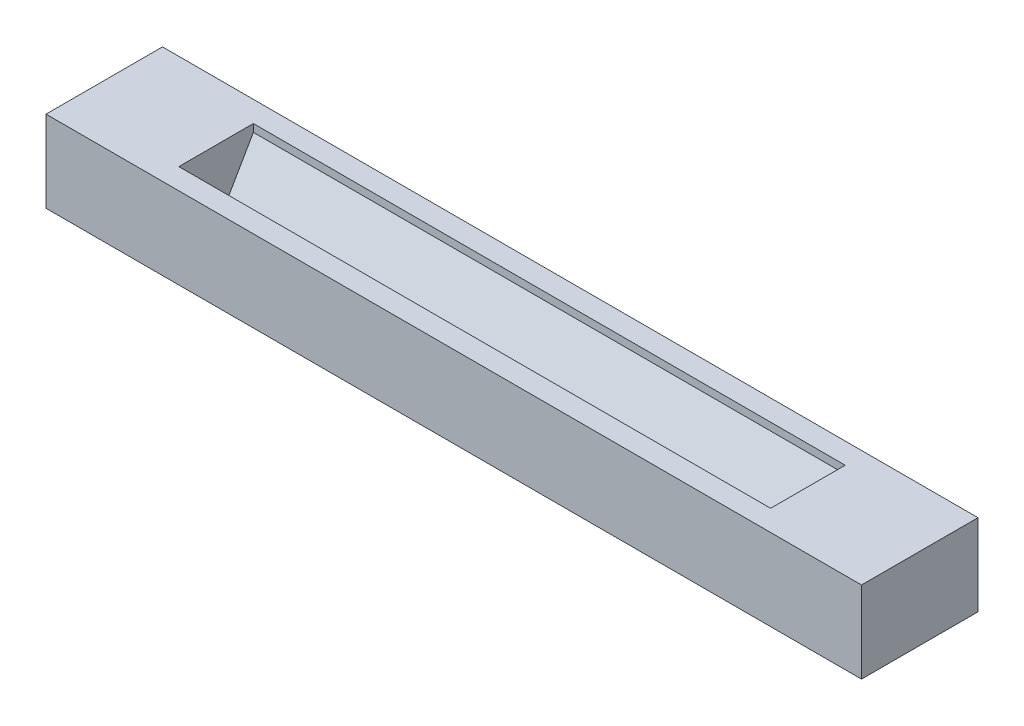
ISO-10303-21;
HEADER;
FILE_DESCRIPTION(('STEP AP214'),'2;1');
FILE_NAME('part.step','',(''),(''),'','','');
FILE_SCHEMA(('AUTOMOTIVE_DESIGN { 1 0 10303 214 1 1 1 1 }'));
ENDSEC;
DATA;
#1=APPLICATION_CONTEXT('core data for automotive mechanical design processes');
#2=APPLICATION_PROTOCOL_DEFINITION('international standard','automotive_design',2000,#1);
#3=PRODUCT_CONTEXT('',#1,'mechanical');
#4=PRODUCT('Part','Part','',(#3));
#5=PRODUCT_RELATED_PRODUCT_CATEGORY('part','',(#4));
#6=PRODUCT_DEFINITION_FORMATION('','',#4);
#7=PRODUCT_DEFINITION_CONTEXT('part definition',#1,'design');
#8=PRODUCT_DEFINITION('design','',#6,#7);
#9=PRODUCT_DEFINITION_SHAPE('','',#8);
#10=(LENGTH_UNIT() NAMED_UNIT(*) SI_UNIT(.MILLI.,.METRE.));
#11=(NAMED_UNIT(*) PLANE_ANGLE_UNIT() SI_UNIT($,.RADIAN.));
#12=(NAMED_UNIT(*) SI_UNIT($,.STERADIAN.) SOLID_ANGLE_UNIT());
#13=UNCERTAINTY_MEASURE_WITH_UNIT(LENGTH_MEASURE(1.E-05),#10,'distance_accuracy_value','');
#14=(GEOMETRIC_REPRESENTATION_CONTEXT(3) GLOBAL_UNCERTAINTY_ASSIGNED_CONTEXT((#13)) GLOBAL_UNIT_ASSIGNED_CONTEXT((#10,
#11,#12)) REPRESENTATION_CONTEXT('',''));
#15=CARTESIAN_POINT('',(0.,0.,0.));
#16=DIRECTION('',(0.,0.,1.));
#17=DIRECTION('',(1.,0.,0.));
#18=AXIS2_PLACEMENT_3D('',#15,#16,#17);
#19=CARTESIAN_POINT('',(-35.,3.5,-1.99999999999998));
#20=DIRECTION('',(0.,0.,1.));
#21=DIRECTION('',(1.,0.,0.));
#22=AXIS2_PLACEMENT_3D('',#19,#20,#21);
#23=PLANE('',#22);
#24=DIRECTION('',(-1.,0.,0.));
#25=VECTOR('',#24,1.);
#26=CARTESIAN_POINT('',(-35.,0.,-1.99999999999998));
#27=LINE('',#26,#25);
#28=CARTESIAN_POINT('',(0.,0.,-2.));
#29=VERTEX_POINT('',#28);
#30=CARTESIAN_POINT('',(-35.,0.,-1.99999999999998));
#31=VERTEX_POINT('',#30);
#32=EDGE_CURVE('E139',#29,#31,#27,.T.);
#33=ORIENTED_EDGE('',*,*,#32,.T.);
#34=DIRECTION('',(0.,-1.,0.));
#35=VECTOR('',#34,1.);
#36=CARTESIAN_POINT('',(-35.,3.5,-1.99999999999998));
#37=LINE('',#36,#35);
#38=CARTESIAN_POINT('',(-35.,3.5,-1.99999999999998));
#39=VERTEX_POINT('',#38);
#40=EDGE_CURVE('E168',#39,#31,#37,.T.);
#41=ORIENTED_EDGE('',*,*,#40,.F.);
#42=DIRECTION('',(-1.,0.,0.));
#43=VECTOR('',#42,1.);
#44=CARTESIAN_POINT('',(-35.,3.5,-1.99999999999998));
#45=LINE('',#44,#43);
#46=CARTESIAN_POINT('',(0.,3.5,-2.));
#47=VERTEX_POINT('',#46);
#48=EDGE_CURVE('E142',#47,#39,#45,.T.);
#49=ORIENTED_EDGE('',*,*,#48,.F.);
#50=DIRECTION('',(0.,-1.,0.));
#51=VECTOR('',#50,1.);
#52=CARTESIAN_POINT('',(0.,3.5,-2.));
#53=LINE('',#52,#51);
#54=EDGE_CURVE('E152',#47,#29,#53,.T.);
#55=ORIENTED_EDGE('',*,*,#54,.T.);
#56=EDGE_LOOP('',(#33,#41,#49,#55));
#57=FACE_BOUND('',#56,.T.);
#58=ADVANCED_FACE('F37',(#57),#23,.F.);
#59=CARTESIAN_POINT('',(-35.,3.5,-1.99999999999998));
#60=DIRECTION('',(1.,0.,0.));
#61=DIRECTION('',(0.,0.,-1.));
#62=AXIS2_PLACEMENT_3D('',#59,#60,#61);
#63=PLANE('',#62);
#64=DIRECTION('',(0.,0.,1.));
#65=VECTOR('',#64,1.);
#66=CARTESIAN_POINT('',(-35.,0.,-1.99999999999998));
#67=LINE('',#66,#65);
#68=CARTESIAN_POINT('',(-35.,0.,3.));
#69=VERTEX_POINT('',#68);
#70=EDGE_CURVE('E155',#31,#69,#67,.T.);
#71=ORIENTED_EDGE('',*,*,#70,.T.);
#72=DIRECTION('',(0.,-1.,0.));
#73=VECTOR('',#72,1.);
#74=CARTESIAN_POINT('',(-35.,3.5,3.));
#75=LINE('',#74,#73);
#76=CARTESIAN_POINT('',(-35.,3.5,3.));
#77=VERTEX_POINT('',#76);
#78=EDGE_CURVE('E165',#77,#69,#75,.T.);
#79=ORIENTED_EDGE('',*,*,#78,.F.);
#80=DIRECTION('',(0.,0.,1.));
#81=VECTOR('',#80,1.);
#82=CARTESIAN_POINT('',(-35.,3.5,-1.99999999999998));
#83=LINE('',#82,#81);
#84=EDGE_CURVE('E145',#39,#77,#83,.T.);
#85=ORIENTED_EDGE('',*,*,#84,.F.);
#86=ORIENTED_EDGE('',*,*,#40,.T.);
#87=EDGE_LOOP('',(#71,#79,#85,#86));
#88=FACE_BOUND('',#87,.T.);
#89=ADVANCED_FACE('F197',(#88),#63,.F.);
#90=CARTESIAN_POINT('',(-35.,3.5,3.));
#91=DIRECTION('',(0.,0.,-1.));
#92=DIRECTION('',(-1.,0.,0.));
#93=AXIS2_PLACEMENT_3D('',#90,#91,#92);
#94=PLANE('',#93);
#95=DIRECTION('',(1.,0.,0.));
#96=VECTOR('',#95,1.);
#97=CARTESIAN_POINT('',(-35.,0.,3.));
#98=LINE('',#97,#96);
#99=CARTESIAN_POINT('',(0.,0.,3.));
#100=VERTEX_POINT('',#99);
#101=EDGE_CURVE('E157',#69,#100,#98,.T.);
#102=ORIENTED_EDGE('',*,*,#101,.T.);
#103=DIRECTION('',(0.,-1.,0.));
#104=VECTOR('',#103,1.);
#105=CARTESIAN_POINT('',(0.,3.5,3.));
#106=LINE('',#105,#104);
#107=CARTESIAN_POINT('',(0.,3.5,3.));
#108=VERTEX_POINT('',#107);
#109=EDGE_CURVE('E162',#108,#100,#106,.T.);
#110=ORIENTED_EDGE('',*,*,#109,.F.);
#111=DIRECTION('',(1.,0.,0.));
#112=VECTOR('',#111,1.);
#113=CARTESIAN_POINT('',(-35.,3.5,3.));
#114=LINE('',#113,#112);
#115=EDGE_CURVE('E148',#77,#108,#114,.T.);
#116=ORIENTED_EDGE('',*,*,#115,.F.);
#117=ORIENTED_EDGE('',*,*,#78,.T.);
#118=EDGE_LOOP('',(#102,#110,#116,#117));
#119=FACE_BOUND('',#118,.T.);
#120=ADVANCED_FACE('F203',(#119),#94,.F.);
#121=CARTESIAN_POINT('',(0.,3.5,-2.));
#122=DIRECTION('',(-1.,0.,0.));
#123=DIRECTION('',(0.,0.,1.));
#124=AXIS2_PLACEMENT_3D('',#121,#122,#123);
#125=PLANE('',#124);
#126=DIRECTION('',(0.,0.,-1.));
#127=VECTOR('',#126,1.);
#128=CARTESIAN_POINT('',(0.,0.,-2.));
#129=LINE('',#128,#127);
#130=EDGE_CURVE('E146',#100,#29,#129,.T.);
#131=ORIENTED_EDGE('',*,*,#130,.T.);
#132=ORIENTED_EDGE('',*,*,#54,.F.);
#133=DIRECTION('',(0.,0.,-1.));
#134=VECTOR('',#133,1.);
#135=CARTESIAN_POINT('',(0.,3.5,-2.));
#136=LINE('',#135,#134);
#137=EDGE_CURVE('E150',#108,#47,#136,.T.);
#138=ORIENTED_EDGE('',*,*,#137,.F.);
#139=ORIENTED_EDGE('',*,*,#109,.T.);
#140=EDGE_LOOP('',(#131,#132,#138,#139));
#141=FACE_BOUND('',#140,.T.);
#142=ADVANCED_FACE('F221',(#141),#125,.F.);
#143=CARTESIAN_POINT('',(0.,3.5,0.));
#144=DIRECTION('',(0.,-1.,0.));
#145=DIRECTION('',(0.,0.,-1.));
#146=AXIS2_PLACEMENT_3D('',#143,#144,#145);
#147=PLANE('',#146);
#148=DIRECTION('',(1.,0.,0.));
#149=VECTOR('',#148,1.);
#150=CARTESIAN_POINT('',(-4.80000000000001,3.5,2.1));
#151=LINE('',#150,#149);
#152=CARTESIAN_POINT('',(-30.2,3.5,2.10000000000001));
#153=VERTEX_POINT('',#152);
#154=CARTESIAN_POINT('',(-4.80000000000001,3.5,2.1));
#155=VERTEX_POINT('',#154);
#156=EDGE_CURVE('E121',#153,#155,#151,.T.);
#157=ORIENTED_EDGE('',*,*,#156,.F.);
#158=DIRECTION('',(0.,0.,1.));
#159=VECTOR('',#158,1.);
#160=CARTESIAN_POINT('',(-30.2,3.5,-1.09999999999999));
#161=LINE('',#160,#159);
#162=CARTESIAN_POINT('',(-30.2,3.5,-1.09999999999999));
#163=VERTEX_POINT('',#162);
#164=EDGE_CURVE('E127',#163,#153,#161,.T.);
#165=ORIENTED_EDGE('',*,*,#164,.F.);
#166=DIRECTION('',(-1.,0.,0.));
#167=VECTOR('',#166,1.);
#168=CARTESIAN_POINT('',(-30.2,3.5,-1.09999999999999));
#169=LINE('',#168,#167);
#170=CARTESIAN_POINT('',(-4.80000000000001,3.5,-1.09999999999999));
#171=VERTEX_POINT('',#170);
#172=EDGE_CURVE('E132',#171,#163,#169,.T.);
#173=ORIENTED_EDGE('',*,*,#172,.F.);
#174=DIRECTION('',(0.,0.,-1.));
#175=VECTOR('',#174,1.);
#176=CARTESIAN_POINT('',(-4.80000000000001,3.5,-1.09999999999999));
#177=LINE('',#176,#175);
#178=EDGE_CURVE('E111',#155,#171,#177,.T.);
#179=ORIENTED_EDGE('',*,*,#178,.F.);
#180=EDGE_LOOP('',(#157,#165,#173,#179));
#181=FACE_BOUND('',#180,.T.);
#182=ORIENTED_EDGE('',*,*,#48,.T.);
#183=ORIENTED_EDGE('',*,*,#84,.T.);
#184=ORIENTED_EDGE('',*,*,#115,.T.);
#185=ORIENTED_EDGE('',*,*,#137,.T.);
#186=EDGE_LOOP('',(#182,#183,#184,#185));
#187=FACE_BOUND('',#186,.T.);
#188=ADVANCED_FACE('F129',(#181,#187),#147,.F.);
#189=CARTESIAN_POINT('',(0.,0.,0.));
#190=DIRECTION('',(0.,-1.,0.));
#191=DIRECTION('',(0.,0.,-1.));
#192=AXIS2_PLACEMENT_3D('',#189,#190,#191);
#193=PLANE('',#192);
#194=ORIENTED_EDGE('',*,*,#32,.F.);
#195=ORIENTED_EDGE('',*,*,#130,.F.);
#196=ORIENTED_EDGE('',*,*,#101,.F.);
#197=ORIENTED_EDGE('',*,*,#70,.F.);
#198=EDGE_LOOP('',(#194,#195,#196,#197));
#199=FACE_BOUND('',#198,.T.);
#200=ADVANCED_FACE('F194',(#199),#193,.T.);
#201=CARTESIAN_POINT('',(-30.2,0.4,-1.09999999999999));
#202=DIRECTION('',(-1.,0.,0.));
#203=DIRECTION('',(0.,0.,1.));
#204=AXIS2_PLACEMENT_3D('',#201,#202,#203);
#205=PLANE('',#204);
#206=DIRECTION('',(0.,0.866025403784442,0.499999999999994));
#207=VECTOR('',#206,1.);
#208=CARTESIAN_POINT('',(-30.2,0.399999999999997,0.500000000000016));
#209=LINE('',#208,#207);
#210=CARTESIAN_POINT('',(-30.2,3.17128129211023,2.10000000000001));
#211=VERTEX_POINT('',#210);
#212=CARTESIAN_POINT('',(-30.2,0.4,0.500000000000018));
#213=VERTEX_POINT('',#212);
#214=EDGE_CURVE('E177',#211,#213,#209,.F.);
#215=ORIENTED_EDGE('',*,*,#214,.T.);
#216=DIRECTION('',(0.,-0.866025403784442,0.499999999999994));
#217=VECTOR('',#216,1.);
#218=CARTESIAN_POINT('',(-30.2,0.400000000000002,0.500000000000003));
#219=LINE('',#218,#217);
#220=CARTESIAN_POINT('',(-30.2,3.17128129211023,-1.09999999999999));
#221=VERTEX_POINT('',#220);
#222=EDGE_CURVE('E60',#213,#221,#219,.F.);
#223=ORIENTED_EDGE('',*,*,#222,.T.);
#224=DIRECTION('',(0.,1.,0.));
#225=VECTOR('',#224,1.);
#226=CARTESIAN_POINT('',(-30.2,0.4,-1.09999999999999));
#227=LINE('',#226,#225);
#228=EDGE_CURVE('E137',#221,#163,#227,.T.);
#229=ORIENTED_EDGE('',*,*,#228,.T.);
#230=ORIENTED_EDGE('',*,*,#164,.T.);
#231=DIRECTION('',(0.,1.,0.));
#232=VECTOR('',#231,1.);
#233=CARTESIAN_POINT('',(-30.2,0.4,2.10000000000001));
#234=LINE('',#233,#232);
#235=EDGE_CURVE('E118',#211,#153,#234,.T.);
#236=ORIENTED_EDGE('',*,*,#235,.F.);
#237=EDGE_LOOP('',(#215,#223,#229,#230,#236));
#238=FACE_BOUND('',#237,.T.);
#239=ADVANCED_FACE('F181',(#238),#205,.F.);
#240=CARTESIAN_POINT('',(-30.2,0.4,-1.09999999999999));
#241=DIRECTION('',(0.,0.,-1.));
#242=DIRECTION('',(-1.,0.,0.));
#243=AXIS2_PLACEMENT_3D('',#240,#241,#242);
#244=PLANE('',#243);
#245=ORIENTED_EDGE('',*,*,#228,.F.);
#246=DIRECTION('',(1.,0.,0.));
#247=VECTOR('',#246,1.);
#248=CARTESIAN_POINT('',(-4.80000000000001,3.17128129211024,-1.09999999999999));
#249=LINE('',#248,#247);
#250=CARTESIAN_POINT('',(-4.80000000000001,3.17128129211023,-1.09999999999999));
#251=VERTEX_POINT('',#250);
#252=EDGE_CURVE('E46',#221,#251,#249,.T.);
#253=ORIENTED_EDGE('',*,*,#252,.T.);
#254=DIRECTION('',(0.,1.,0.));
#255=VECTOR('',#254,1.);
#256=CARTESIAN_POINT('',(-4.80000000000001,0.4,-1.09999999999999));
#257=LINE('',#256,#255);
#258=EDGE_CURVE('E117',#251,#171,#257,.T.);
#259=ORIENTED_EDGE('',*,*,#258,.T.);
#260=ORIENTED_EDGE('',*,*,#172,.T.);
#261=EDGE_LOOP('',(#245,#253,#259,#260));
#262=FACE_BOUND('',#261,.T.);
#263=ADVANCED_FACE('F186',(#262),#244,.F.);
#264=CARTESIAN_POINT('',(-4.80000000000001,0.4,-1.09999999999999));
#265=DIRECTION('',(1.,0.,0.));
#266=DIRECTION('',(0.,0.,-1.));
#267=AXIS2_PLACEMENT_3D('',#264,#265,#266);
#268=PLANE('',#267);
#269=ORIENTED_EDGE('',*,*,#258,.F.);
#270=DIRECTION('',(0.,0.866025403784442,-0.499999999999994));
#271=VECTOR('',#270,1.);
#272=CARTESIAN_POINT('',(-4.80000000000001,0.4,0.500000000000001));
#273=LINE('',#272,#271);
#274=CARTESIAN_POINT('',(-4.80000000000001,0.4,0.500000000000012));
#275=VERTEX_POINT('',#274);
#276=EDGE_CURVE('E11',#251,#275,#273,.F.);
#277=ORIENTED_EDGE('',*,*,#276,.T.);
#278=DIRECTION('',(0.,-0.866025403784442,-0.499999999999994));
#279=VECTOR('',#278,1.);
#280=CARTESIAN_POINT('',(-4.80000000000001,0.4,0.500000000000012));
#281=LINE('',#280,#279);
#282=CARTESIAN_POINT('',(-4.80000000000001,3.17128129211023,2.1));
#283=VERTEX_POINT('',#282);
#284=EDGE_CURVE('E114',#275,#283,#281,.F.);
#285=ORIENTED_EDGE('',*,*,#284,.T.);
#286=DIRECTION('',(0.,1.,0.));
#287=VECTOR('',#286,1.);
#288=CARTESIAN_POINT('',(-4.80000000000001,0.4,2.1));
#289=LINE('',#288,#287);
#290=EDGE_CURVE('E107',#283,#155,#289,.T.);
#291=ORIENTED_EDGE('',*,*,#290,.T.);
#292=ORIENTED_EDGE('',*,*,#178,.T.);
#293=EDGE_LOOP('',(#269,#277,#285,#291,#292));
#294=FACE_BOUND('',#293,.T.);
#295=ADVANCED_FACE('F109',(#294),#268,.F.);
#296=CARTESIAN_POINT('',(-4.80000000000001,0.4,2.1));
#297=DIRECTION('',(0.,0.,1.));
#298=DIRECTION('',(1.,0.,0.));
#299=AXIS2_PLACEMENT_3D('',#296,#297,#298);
#300=PLANE('',#299);
#301=ORIENTED_EDGE('',*,*,#290,.F.);
#302=DIRECTION('',(-1.,0.,0.));
#303=VECTOR('',#302,1.);
#304=CARTESIAN_POINT('',(-30.2,3.17128129211024,2.10000000000001));
#305=LINE('',#304,#303);
#306=EDGE_CURVE('E175',#283,#211,#305,.T.);
#307=ORIENTED_EDGE('',*,*,#306,.T.);
#308=ORIENTED_EDGE('',*,*,#235,.T.);
#309=ORIENTED_EDGE('',*,*,#156,.T.);
#310=EDGE_LOOP('',(#301,#307,#308,#309));
#311=FACE_BOUND('',#310,.T.);
#312=ADVANCED_FACE('F122',(#311),#300,.F.);
#313=CARTESIAN_POINT('',(0.,0.4,0.500000000000011));
#314=DIRECTION('',(0.,0.499999999999994,-0.866025403784442));
#315=DIRECTION('',(-1.,0.,0.));
#316=AXIS2_PLACEMENT_3D('',#313,#314,#315);
#317=PLANE('',#316);
#318=ORIENTED_EDGE('',*,*,#214,.F.);
#319=ORIENTED_EDGE('',*,*,#306,.F.);
#320=ORIENTED_EDGE('',*,*,#284,.F.);
#321=DIRECTION('',(1.,0.,0.));
#322=VECTOR('',#321,1.);
#323=CARTESIAN_POINT('',(-4.80000000000001,0.4,0.500000000000012));
#324=LINE('',#323,#322);
#325=EDGE_CURVE('E171',#213,#275,#324,.T.);
#326=ORIENTED_EDGE('',*,*,#325,.F.);
#327=EDGE_LOOP('',(#318,#319,#320,#326));
#328=FACE_BOUND('',#327,.T.);
#329=ADVANCED_FACE('F183',(#328),#317,.T.);
#330=CARTESIAN_POINT('',(0.,0.4,0.5));
#331=DIRECTION('',(0.,0.499999999999994,0.866025403784442));
#332=DIRECTION('',(1.,0.,0.));
#333=AXIS2_PLACEMENT_3D('',#330,#331,#332);
#334=PLANE('',#333);
#335=ORIENTED_EDGE('',*,*,#276,.F.);
#336=ORIENTED_EDGE('',*,*,#252,.F.);
#337=ORIENTED_EDGE('',*,*,#222,.F.);
#338=ORIENTED_EDGE('',*,*,#325,.T.);
#339=EDGE_LOOP('',(#335,#336,#337,#338));
#340=FACE_BOUND('',#339,.T.);
#341=ADVANCED_FACE('F40',(#340),#334,.T.);
#342=CLOSED_SHELL('',(#58,#89,#120,#142,#188,#200,#239,#263,#295,#312,#329,#341));
#343=MANIFOLD_SOLID_BREP('B2',#342);
#344=ADVANCED_BREP_SHAPE_REPRESENTATION('',(#18,#343),#14);
#345=SHAPE_DEFINITION_REPRESENTATION(#9,#344);
ENDSEC;
END-ISO-10303-21;
